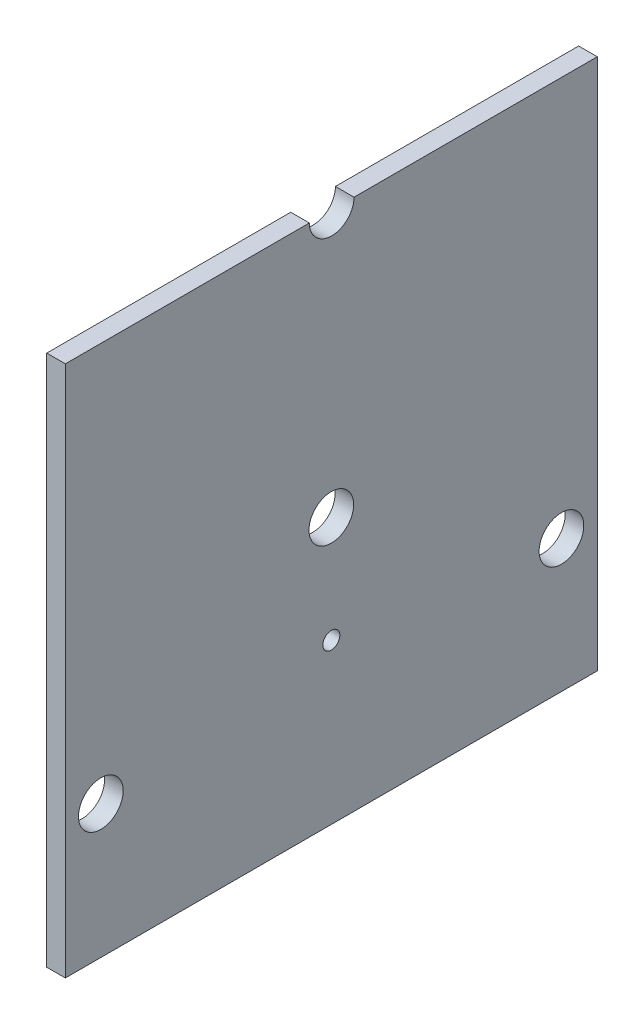
ISO-10303-21;
HEADER;
FILE_DESCRIPTION(('STEP AP214'),'2;1');
FILE_NAME('part.step','',(''),(''),'','','');
FILE_SCHEMA(('AUTOMOTIVE_DESIGN { 1 0 10303 214 1 1 1 1 }'));
ENDSEC;
DATA;
#1=APPLICATION_CONTEXT('core data for automotive mechanical design processes');
#2=APPLICATION_PROTOCOL_DEFINITION('international standard','automotive_design',2000,#1);
#3=PRODUCT_CONTEXT('',#1,'mechanical');
#4=PRODUCT('Part','Part','',(#3));
#5=PRODUCT_RELATED_PRODUCT_CATEGORY('part','',(#4));
#6=PRODUCT_DEFINITION_FORMATION('','',#4);
#7=PRODUCT_DEFINITION_CONTEXT('part definition',#1,'design');
#8=PRODUCT_DEFINITION('design','',#6,#7);
#9=PRODUCT_DEFINITION_SHAPE('','',#8);
#10=(LENGTH_UNIT() NAMED_UNIT(*) SI_UNIT(.MILLI.,.METRE.));
#11=(NAMED_UNIT(*) PLANE_ANGLE_UNIT() SI_UNIT($,.RADIAN.));
#12=(NAMED_UNIT(*) SI_UNIT($,.STERADIAN.) SOLID_ANGLE_UNIT());
#13=UNCERTAINTY_MEASURE_WITH_UNIT(LENGTH_MEASURE(1.E-05),#10,'distance_accuracy_value','');
#14=(GEOMETRIC_REPRESENTATION_CONTEXT(3) GLOBAL_UNCERTAINTY_ASSIGNED_CONTEXT((#13)) GLOBAL_UNIT_ASSIGNED_CONTEXT((#10,
#11,#12)) REPRESENTATION_CONTEXT('',''));
#15=CARTESIAN_POINT('',(0.,0.,0.));
#16=DIRECTION('',(0.,0.,1.));
#17=DIRECTION('',(1.,0.,0.));
#18=AXIS2_PLACEMENT_3D('',#15,#16,#17);
#19=CARTESIAN_POINT('',(3.5,50.,50.));
#20=DIRECTION('',(0.,-1.,0.));
#21=DIRECTION('',(0.,0.,-1.));
#22=AXIS2_PLACEMENT_3D('',#19,#20,#21);
#23=PLANE('',#22);
#24=DIRECTION('',(0.,0.,1.));
#25=VECTOR('',#24,1.);
#26=CARTESIAN_POINT('',(3.5,50.,50.));
#27=LINE('',#26,#25);
#28=CARTESIAN_POINT('',(3.5,50.,4.12849793611253));
#29=VERTEX_POINT('',#28);
#30=CARTESIAN_POINT('',(3.5,50.,50.));
#31=VERTEX_POINT('',#30);
#32=EDGE_CURVE('E62',#29,#31,#27,.T.);
#33=ORIENTED_EDGE('',*,*,#32,.F.);
#34=DIRECTION('',(-1.,0.,0.));
#35=VECTOR('',#34,1.);
#36=CARTESIAN_POINT('',(3.5,50.,4.12849793611253));
#37=LINE('',#36,#35);
#38=CARTESIAN_POINT('',(0.,50.,4.12849793611253));
#39=VERTEX_POINT('',#38);
#40=EDGE_CURVE('E11',#29,#39,#37,.T.);
#41=ORIENTED_EDGE('',*,*,#40,.T.);
#42=DIRECTION('',(0.,0.,1.));
#43=VECTOR('',#42,1.);
#44=CARTESIAN_POINT('',(0.,50.,50.));
#45=LINE('',#44,#43);
#46=CARTESIAN_POINT('',(0.,50.,50.));
#47=VERTEX_POINT('',#46);
#48=EDGE_CURVE('E83',#39,#47,#45,.T.);
#49=ORIENTED_EDGE('',*,*,#48,.T.);
#50=DIRECTION('',(-1.,0.,0.));
#51=VECTOR('',#50,1.);
#52=CARTESIAN_POINT('',(3.5,50.,50.));
#53=LINE('',#52,#51);
#54=EDGE_CURVE('E119',#31,#47,#53,.T.);
#55=ORIENTED_EDGE('',*,*,#54,.F.);
#56=EDGE_LOOP('',(#33,#41,#49,#55));
#57=FACE_BOUND('',#56,.T.);
#58=ADVANCED_FACE('F39',(#57),#23,.F.);
#59=CARTESIAN_POINT('',(3.5,0.,0.));
#60=DIRECTION('',(1.,0.,0.));
#61=DIRECTION('',(0.,0.,-1.));
#62=AXIS2_PLACEMENT_3D('',#59,#60,#61);
#63=PLANE('',#62);
#64=CARTESIAN_POINT('',(3.5,-20.,0.));
#65=DIRECTION('',(-1.,0.,0.));
#66=DIRECTION('',(0.,0.,1.));
#67=AXIS2_PLACEMENT_3D('',#64,#65,#66);
#68=CIRCLE('',#67,1.6);
#69=CARTESIAN_POINT('',(3.5,-20.,1.6));
#70=VERTEX_POINT('',#69);
#71=EDGE_CURVE('E104',#70,#70,#68,.T.);
#72=ORIENTED_EDGE('',*,*,#71,.T.);
#73=EDGE_LOOP('',(#72));
#74=FACE_BOUND('',#73,.T.);
#75=CARTESIAN_POINT('',(3.5,-25.0618970407415,-43.2654748814718));
#76=DIRECTION('',(-1.,0.,0.));
#77=DIRECTION('',(0.,0.,1.));
#78=AXIS2_PLACEMENT_3D('',#75,#76,#77);
#79=CIRCLE('',#78,4.2);
#80=CARTESIAN_POINT('',(3.5,-25.0618970407415,-39.0654748814718));
#81=VERTEX_POINT('',#80);
#82=EDGE_CURVE('E159',#81,#81,#79,.T.);
#83=ORIENTED_EDGE('',*,*,#82,.T.);
#84=EDGE_LOOP('',(#83));
#85=FACE_BOUND('',#84,.T.);
#86=CARTESIAN_POINT('',(3.5,49.9999488745229,-0.0715020635763067));
#87=DIRECTION('',(-1.,0.,0.));
#88=DIRECTION('',(0.,0.,1.));
#89=AXIS2_PLACEMENT_3D('',#86,#87,#88);
#90=CIRCLE('',#89,4.2);
#91=CARTESIAN_POINT('',(3.5,50.,-4.27150206357631));
#92=VERTEX_POINT('',#91);
#93=EDGE_CURVE('E54',#92,#29,#90,.T.);
#94=ORIENTED_EDGE('',*,*,#93,.T.);
#95=ORIENTED_EDGE('',*,*,#32,.T.);
#96=DIRECTION('',(0.,-1.,0.));
#97=VECTOR('',#96,1.);
#98=CARTESIAN_POINT('',(3.5,50.,50.));
#99=LINE('',#98,#97);
#100=CARTESIAN_POINT('',(3.5,-50.,50.));
#101=VERTEX_POINT('',#100);
#102=EDGE_CURVE('E114',#31,#101,#99,.T.);
#103=ORIENTED_EDGE('',*,*,#102,.T.);
#104=DIRECTION('',(0.,0.,-1.));
#105=VECTOR('',#104,1.);
#106=CARTESIAN_POINT('',(3.5,-50.,50.));
#107=LINE('',#106,#105);
#108=CARTESIAN_POINT('',(3.5,-50.,-50.));
#109=VERTEX_POINT('',#108);
#110=EDGE_CURVE('E91',#101,#109,#107,.T.);
#111=ORIENTED_EDGE('',*,*,#110,.T.);
#112=DIRECTION('',(0.,1.,0.));
#113=VECTOR('',#112,1.);
#114=CARTESIAN_POINT('',(3.5,50.,-50.));
#115=LINE('',#114,#113);
#116=CARTESIAN_POINT('',(3.5,50.,-50.));
#117=VERTEX_POINT('',#116);
#118=EDGE_CURVE('E136',#109,#117,#115,.T.);
#119=ORIENTED_EDGE('',*,*,#118,.T.);
#120=EDGE_CURVE('E122',#117,#92,#27,.T.);
#121=ORIENTED_EDGE('',*,*,#120,.T.);
#122=EDGE_LOOP('',(#94,#95,#103,#111,#119,#121));
#123=FACE_BOUND('',#122,.T.);
#124=CARTESIAN_POINT('',(3.5,-24.9380518337814,43.3369769450481));
#125=DIRECTION('',(-1.,0.,0.));
#126=DIRECTION('',(0.,0.,1.));
#127=AXIS2_PLACEMENT_3D('',#124,#125,#126);
#128=CIRCLE('',#127,4.2);
#129=CARTESIAN_POINT('',(3.5,-24.9380518337814,47.5369769450481));
#130=VERTEX_POINT('',#129);
#131=EDGE_CURVE('E153',#130,#130,#128,.T.);
#132=ORIENTED_EDGE('',*,*,#131,.T.);
#133=EDGE_LOOP('',(#132));
#134=FACE_BOUND('',#133,.T.);
#135=CARTESIAN_POINT('',(3.5,0.,0.));
#136=DIRECTION('',(1.,0.,0.));
#137=DIRECTION('',(0.,0.,-1.));
#138=AXIS2_PLACEMENT_3D('',#135,#136,#137);
#139=CIRCLE('',#138,4.2);
#140=CARTESIAN_POINT('',(3.5,0.,-4.2));
#141=VERTEX_POINT('',#140);
#142=EDGE_CURVE('E142',#141,#141,#139,.T.);
#143=ORIENTED_EDGE('',*,*,#142,.F.);
#144=EDGE_LOOP('',(#143));
#145=FACE_BOUND('',#144,.T.);
#146=ADVANCED_FACE('F133',(#74,#85,#123,#134,#145),#63,.T.);
#147=CARTESIAN_POINT('',(0.,0.,0.));
#148=DIRECTION('',(1.,0.,0.));
#149=DIRECTION('',(0.,0.,-1.));
#150=AXIS2_PLACEMENT_3D('',#147,#148,#149);
#151=PLANE('',#150);
#152=CARTESIAN_POINT('',(0.,-20.,0.));
#153=DIRECTION('',(-1.,0.,0.));
#154=DIRECTION('',(0.,0.,1.));
#155=AXIS2_PLACEMENT_3D('',#152,#153,#154);
#156=CIRCLE('',#155,1.6);
#157=CARTESIAN_POINT('',(0.,-20.,1.6));
#158=VERTEX_POINT('',#157);
#159=EDGE_CURVE('E168',#158,#158,#156,.T.);
#160=ORIENTED_EDGE('',*,*,#159,.F.);
#161=EDGE_LOOP('',(#160));
#162=FACE_BOUND('',#161,.T.);
#163=CARTESIAN_POINT('',(0.,-25.0618970407415,-43.2654748814718));
#164=DIRECTION('',(-1.,0.,0.));
#165=DIRECTION('',(0.,0.,1.));
#166=AXIS2_PLACEMENT_3D('',#163,#164,#165);
#167=CIRCLE('',#166,4.2);
#168=CARTESIAN_POINT('',(0.,-25.0618970407415,-39.0654748814718));
#169=VERTEX_POINT('',#168);
#170=EDGE_CURVE('E163',#169,#169,#167,.T.);
#171=ORIENTED_EDGE('',*,*,#170,.F.);
#172=EDGE_LOOP('',(#171));
#173=FACE_BOUND('',#172,.T.);
#174=CARTESIAN_POINT('',(0.,-24.9380518337814,43.3369769450481));
#175=DIRECTION('',(-1.,0.,0.));
#176=DIRECTION('',(0.,0.,1.));
#177=AXIS2_PLACEMENT_3D('',#174,#175,#176);
#178=CIRCLE('',#177,4.2);
#179=CARTESIAN_POINT('',(0.,-24.9380518337814,47.5369769450481));
#180=VERTEX_POINT('',#179);
#181=EDGE_CURVE('E156',#180,#180,#178,.T.);
#182=ORIENTED_EDGE('',*,*,#181,.F.);
#183=EDGE_LOOP('',(#182));
#184=FACE_BOUND('',#183,.T.);
#185=ORIENTED_EDGE('',*,*,#48,.F.);
#186=CARTESIAN_POINT('',(0.,49.9999488745229,-0.0715020635763067));
#187=DIRECTION('',(-1.,0.,0.));
#188=DIRECTION('',(0.,0.,1.));
#189=AXIS2_PLACEMENT_3D('',#186,#187,#188);
#190=CIRCLE('',#189,4.2);
#191=CARTESIAN_POINT('',(0.,50.,-4.27150206326514));
#192=VERTEX_POINT('',#191);
#193=EDGE_CURVE('E99',#192,#39,#190,.T.);
#194=ORIENTED_EDGE('',*,*,#193,.F.);
#195=CARTESIAN_POINT('',(0.,50.,-50.));
#196=VERTEX_POINT('',#195);
#197=EDGE_CURVE('E111',#196,#192,#45,.T.);
#198=ORIENTED_EDGE('',*,*,#197,.F.);
#199=DIRECTION('',(0.,1.,0.));
#200=VECTOR('',#199,1.);
#201=CARTESIAN_POINT('',(0.,50.,-50.));
#202=LINE('',#201,#200);
#203=CARTESIAN_POINT('',(0.,-50.,-50.));
#204=VERTEX_POINT('',#203);
#205=EDGE_CURVE('E112',#204,#196,#202,.T.);
#206=ORIENTED_EDGE('',*,*,#205,.F.);
#207=DIRECTION('',(0.,0.,-1.));
#208=VECTOR('',#207,1.);
#209=CARTESIAN_POINT('',(0.,-50.,50.));
#210=LINE('',#209,#208);
#211=CARTESIAN_POINT('',(0.,-50.,50.));
#212=VERTEX_POINT('',#211);
#213=EDGE_CURVE('E115',#212,#204,#210,.T.);
#214=ORIENTED_EDGE('',*,*,#213,.F.);
#215=DIRECTION('',(0.,-1.,0.));
#216=VECTOR('',#215,1.);
#217=CARTESIAN_POINT('',(0.,50.,50.));
#218=LINE('',#217,#216);
#219=EDGE_CURVE('E110',#47,#212,#218,.T.);
#220=ORIENTED_EDGE('',*,*,#219,.F.);
#221=EDGE_LOOP('',(#185,#194,#198,#206,#214,#220));
#222=FACE_BOUND('',#221,.T.);
#223=CARTESIAN_POINT('',(0.,0.,0.));
#224=DIRECTION('',(1.,0.,0.));
#225=DIRECTION('',(0.,0.,-1.));
#226=AXIS2_PLACEMENT_3D('',#223,#224,#225);
#227=CIRCLE('',#226,4.2);
#228=CARTESIAN_POINT('',(0.,0.,-4.2));
#229=VERTEX_POINT('',#228);
#230=EDGE_CURVE('E150',#229,#229,#227,.T.);
#231=ORIENTED_EDGE('',*,*,#230,.T.);
#232=EDGE_LOOP('',(#231));
#233=FACE_BOUND('',#232,.T.);
#234=ADVANCED_FACE('F107',(#162,#173,#184,#222,#233),#151,.F.);
#235=CARTESIAN_POINT('',(3.5,50.,50.));
#236=DIRECTION('',(0.,0.,-1.));
#237=DIRECTION('',(-1.,0.,0.));
#238=AXIS2_PLACEMENT_3D('',#235,#236,#237);
#239=PLANE('',#238);
#240=ORIENTED_EDGE('',*,*,#219,.T.);
#241=DIRECTION('',(-1.,0.,0.));
#242=VECTOR('',#241,1.);
#243=CARTESIAN_POINT('',(3.5,-50.,50.));
#244=LINE('',#243,#242);
#245=EDGE_CURVE('E128',#101,#212,#244,.T.);
#246=ORIENTED_EDGE('',*,*,#245,.F.);
#247=ORIENTED_EDGE('',*,*,#102,.F.);
#248=ORIENTED_EDGE('',*,*,#54,.T.);
#249=EDGE_LOOP('',(#240,#246,#247,#248));
#250=FACE_BOUND('',#249,.T.);
#251=ADVANCED_FACE('F41',(#250),#239,.F.);
#252=CARTESIAN_POINT('',(3.5,-50.,50.));
#253=DIRECTION('',(0.,1.,0.));
#254=DIRECTION('',(0.,0.,1.));
#255=AXIS2_PLACEMENT_3D('',#252,#253,#254);
#256=PLANE('',#255);
#257=ORIENTED_EDGE('',*,*,#213,.T.);
#258=DIRECTION('',(-1.,0.,0.));
#259=VECTOR('',#258,1.);
#260=CARTESIAN_POINT('',(3.5,-50.,-50.));
#261=LINE('',#260,#259);
#262=EDGE_CURVE('E125',#109,#204,#261,.T.);
#263=ORIENTED_EDGE('',*,*,#262,.F.);
#264=ORIENTED_EDGE('',*,*,#110,.F.);
#265=ORIENTED_EDGE('',*,*,#245,.T.);
#266=EDGE_LOOP('',(#257,#263,#264,#265));
#267=FACE_BOUND('',#266,.T.);
#268=ADVANCED_FACE('F143',(#267),#256,.F.);
#269=CARTESIAN_POINT('',(3.5,50.,-50.));
#270=DIRECTION('',(0.,0.,1.));
#271=DIRECTION('',(1.,0.,0.));
#272=AXIS2_PLACEMENT_3D('',#269,#270,#271);
#273=PLANE('',#272);
#274=ORIENTED_EDGE('',*,*,#205,.T.);
#275=DIRECTION('',(-1.,0.,0.));
#276=VECTOR('',#275,1.);
#277=CARTESIAN_POINT('',(3.5,50.,-50.));
#278=LINE('',#277,#276);
#279=EDGE_CURVE('E121',#117,#196,#278,.T.);
#280=ORIENTED_EDGE('',*,*,#279,.F.);
#281=ORIENTED_EDGE('',*,*,#118,.F.);
#282=ORIENTED_EDGE('',*,*,#262,.T.);
#283=EDGE_LOOP('',(#274,#280,#281,#282));
#284=FACE_BOUND('',#283,.T.);
#285=ADVANCED_FACE('F147',(#284),#273,.F.);
#286=ORIENTED_EDGE('',*,*,#197,.T.);
#287=DIRECTION('',(-1.,0.,0.));
#288=VECTOR('',#287,1.);
#289=CARTESIAN_POINT('',(3.5,50.,-4.27150206326514));
#290=LINE('',#289,#288);
#291=EDGE_CURVE('E47',#192,#92,#290,.F.);
#292=ORIENTED_EDGE('',*,*,#291,.T.);
#293=ORIENTED_EDGE('',*,*,#120,.F.);
#294=ORIENTED_EDGE('',*,*,#279,.T.);
#295=EDGE_LOOP('',(#286,#292,#293,#294));
#296=FACE_BOUND('',#295,.T.);
#297=ADVANCED_FACE('F132',(#296),#23,.F.);
#298=CARTESIAN_POINT('',(3.5,0.,0.));
#299=DIRECTION('',(-1.,0.,0.));
#300=DIRECTION('',(0.,0.,1.));
#301=AXIS2_PLACEMENT_3D('',#298,#299,#300);
#302=CYLINDRICAL_SURFACE('',#301,4.2);
#303=ORIENTED_EDGE('',*,*,#142,.T.);
#304=EDGE_LOOP('',(#303));
#305=FACE_BOUND('',#304,.T.);
#306=ORIENTED_EDGE('',*,*,#230,.F.);
#307=EDGE_LOOP('',(#306));
#308=FACE_BOUND('',#307,.T.);
#309=ADVANCED_FACE('F192',(#305,#308),#302,.F.);
#310=CARTESIAN_POINT('',(3.5,-24.9380518337814,43.3369769450481));
#311=DIRECTION('',(-1.,0.,0.));
#312=DIRECTION('',(0.,0.,1.));
#313=AXIS2_PLACEMENT_3D('',#310,#311,#312);
#314=CYLINDRICAL_SURFACE('',#313,4.2);
#315=ORIENTED_EDGE('',*,*,#131,.F.);
#316=EDGE_LOOP('',(#315));
#317=FACE_BOUND('',#316,.T.);
#318=ORIENTED_EDGE('',*,*,#181,.T.);
#319=EDGE_LOOP('',(#318));
#320=FACE_BOUND('',#319,.T.);
#321=ADVANCED_FACE('F190',(#317,#320),#314,.F.);
#322=CARTESIAN_POINT('',(3.5,49.9999488745229,-0.0715020635763067));
#323=DIRECTION('',(-1.,0.,0.));
#324=DIRECTION('',(0.,0.,1.));
#325=AXIS2_PLACEMENT_3D('',#322,#323,#324);
#326=CYLINDRICAL_SURFACE('',#325,4.2);
#327=ORIENTED_EDGE('',*,*,#93,.F.);
#328=ORIENTED_EDGE('',*,*,#291,.F.);
#329=ORIENTED_EDGE('',*,*,#193,.T.);
#330=ORIENTED_EDGE('',*,*,#40,.F.);
#331=EDGE_LOOP('',(#327,#328,#329,#330));
#332=FACE_BOUND('',#331,.T.);
#333=ADVANCED_FACE('F100',(#332),#326,.F.);
#334=CARTESIAN_POINT('',(3.5,-25.0618970407415,-43.2654748814718));
#335=DIRECTION('',(-1.,0.,0.));
#336=DIRECTION('',(0.,0.,1.));
#337=AXIS2_PLACEMENT_3D('',#334,#335,#336);
#338=CYLINDRICAL_SURFACE('',#337,4.2);
#339=ORIENTED_EDGE('',*,*,#82,.F.);
#340=EDGE_LOOP('',(#339));
#341=FACE_BOUND('',#340,.T.);
#342=ORIENTED_EDGE('',*,*,#170,.T.);
#343=EDGE_LOOP('',(#342));
#344=FACE_BOUND('',#343,.T.);
#345=ADVANCED_FACE('F179',(#341,#344),#338,.F.);
#346=CARTESIAN_POINT('',(3.5,-20.,0.));
#347=DIRECTION('',(-1.,0.,0.));
#348=DIRECTION('',(0.,0.,1.));
#349=AXIS2_PLACEMENT_3D('',#346,#347,#348);
#350=CYLINDRICAL_SURFACE('',#349,1.6);
#351=ORIENTED_EDGE('',*,*,#71,.F.);
#352=EDGE_LOOP('',(#351));
#353=FACE_BOUND('',#352,.T.);
#354=ORIENTED_EDGE('',*,*,#159,.T.);
#355=EDGE_LOOP('',(#354));
#356=FACE_BOUND('',#355,.T.);
#357=ADVANCED_FACE('F176',(#353,#356),#350,.F.);
#358=CLOSED_SHELL('',(#58,#146,#234,#251,#268,#285,#297,#309,#321,#333,#345,#357));
#359=MANIFOLD_SOLID_BREP('B2',#358);
#360=ADVANCED_BREP_SHAPE_REPRESENTATION('',(#18,#359),#14);
#361=SHAPE_DEFINITION_REPRESENTATION(#9,#360);
ENDSEC;
END-ISO-10303-21;
